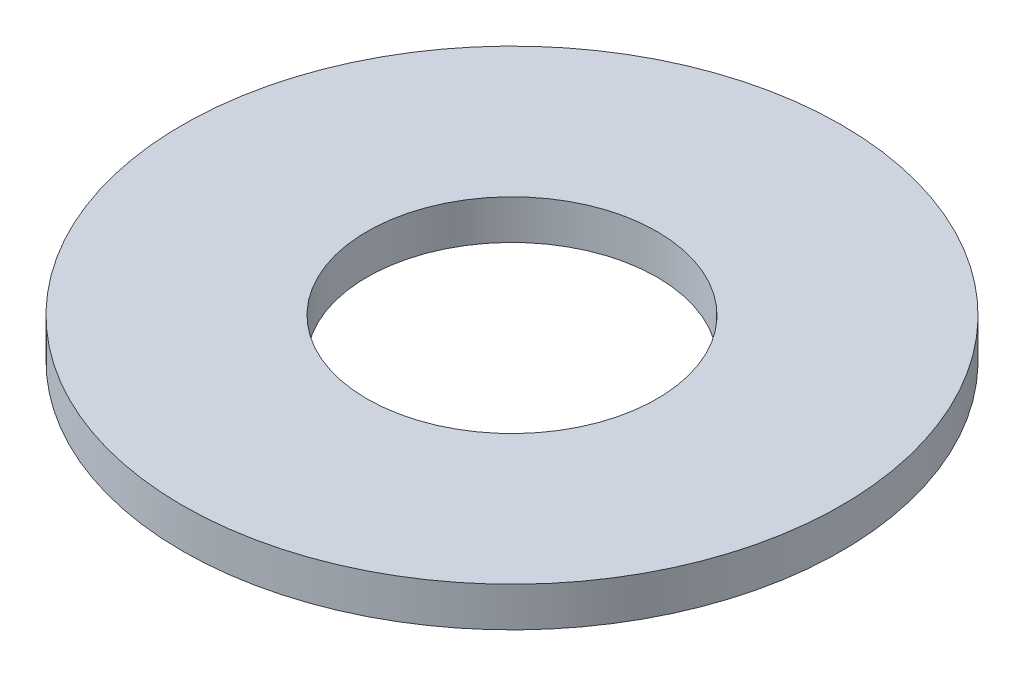
ISO-10303-21;
HEADER;
FILE_DESCRIPTION(('STEP AP214'),'2;1');
FILE_NAME('part.step','',(''),(''),'','','');
FILE_SCHEMA(('AUTOMOTIVE_DESIGN { 1 0 10303 214 1 1 1 1 }'));
ENDSEC;
DATA;
#1=APPLICATION_CONTEXT('core data for automotive mechanical design processes');
#2=APPLICATION_PROTOCOL_DEFINITION('international standard','automotive_design',2000,#1);
#3=PRODUCT_CONTEXT('',#1,'mechanical');
#4=PRODUCT('Part','Part','',(#3));
#5=PRODUCT_RELATED_PRODUCT_CATEGORY('part','',(#4));
#6=PRODUCT_DEFINITION_FORMATION('','',#4);
#7=PRODUCT_DEFINITION_CONTEXT('part definition',#1,'design');
#8=PRODUCT_DEFINITION('design','',#6,#7);
#9=PRODUCT_DEFINITION_SHAPE('','',#8);
#10=(LENGTH_UNIT() NAMED_UNIT(*) SI_UNIT(.MILLI.,.METRE.));
#11=(NAMED_UNIT(*) PLANE_ANGLE_UNIT() SI_UNIT($,.RADIAN.));
#12=(NAMED_UNIT(*) SI_UNIT($,.STERADIAN.) SOLID_ANGLE_UNIT());
#13=UNCERTAINTY_MEASURE_WITH_UNIT(LENGTH_MEASURE(1.E-05),#10,'distance_accuracy_value','');
#14=(GEOMETRIC_REPRESENTATION_CONTEXT(3) GLOBAL_UNCERTAINTY_ASSIGNED_CONTEXT((#13)) GLOBAL_UNIT_ASSIGNED_CONTEXT((#10,
#11,#12)) REPRESENTATION_CONTEXT('',''));
#15=CARTESIAN_POINT('',(0.,0.,0.));
#16=DIRECTION('',(0.,0.,1.));
#17=DIRECTION('',(1.,0.,0.));
#18=AXIS2_PLACEMENT_3D('',#15,#16,#17);
#19=CARTESIAN_POINT('',(0.,0.15,0.));
#20=DIRECTION('',(0.,1.,0.));
#21=DIRECTION('',(0.,0.,1.));
#22=AXIS2_PLACEMENT_3D('',#19,#20,#21);
#23=PLANE('',#22);
#24=CARTESIAN_POINT('',(0.,0.15,0.));
#25=DIRECTION('',(0.,1.,0.));
#26=DIRECTION('',(0.,0.,1.));
#27=AXIS2_PLACEMENT_3D('',#24,#25,#26);
#28=CIRCLE('',#27,2.5);
#29=CARTESIAN_POINT('',(0.,0.15,2.5));
#30=VERTEX_POINT('',#29);
#31=EDGE_CURVE('E10',#30,#30,#28,.T.);
#32=ORIENTED_EDGE('',*,*,#31,.T.);
#33=EDGE_LOOP('',(#32));
#34=FACE_BOUND('',#33,.T.);
#35=CARTESIAN_POINT('',(0.,0.15,0.));
#36=DIRECTION('',(0.,1.,0.));
#37=DIRECTION('',(0.,0.,1.));
#38=AXIS2_PLACEMENT_3D('',#35,#36,#37);
#39=CIRCLE('',#38,1.1);
#40=CARTESIAN_POINT('',(0.,0.15,1.1));
#41=VERTEX_POINT('',#40);
#42=EDGE_CURVE('E50',#41,#41,#39,.T.);
#43=ORIENTED_EDGE('',*,*,#42,.F.);
#44=EDGE_LOOP('',(#43));
#45=FACE_BOUND('',#44,.T.);
#46=ADVANCED_FACE('F37',(#34,#45),#23,.T.);
#47=CARTESIAN_POINT('',(0.,-0.15,0.));
#48=DIRECTION('',(0.,1.,0.));
#49=DIRECTION('',(0.,0.,1.));
#50=AXIS2_PLACEMENT_3D('',#47,#48,#49);
#51=PLANE('',#50);
#52=CARTESIAN_POINT('',(0.,-0.15,0.));
#53=DIRECTION('',(0.,1.,0.));
#54=DIRECTION('',(0.,0.,1.));
#55=AXIS2_PLACEMENT_3D('',#52,#53,#54);
#56=CIRCLE('',#55,2.5);
#57=CARTESIAN_POINT('',(0.,-0.15,2.5));
#58=VERTEX_POINT('',#57);
#59=EDGE_CURVE('E41',#58,#58,#56,.T.);
#60=ORIENTED_EDGE('',*,*,#59,.F.);
#61=EDGE_LOOP('',(#60));
#62=FACE_BOUND('',#61,.T.);
#63=CARTESIAN_POINT('',(0.,-0.15,0.));
#64=DIRECTION('',(0.,1.,0.));
#65=DIRECTION('',(0.,0.,1.));
#66=AXIS2_PLACEMENT_3D('',#63,#64,#65);
#67=CIRCLE('',#66,1.1);
#68=CARTESIAN_POINT('',(0.,-0.15,1.1));
#69=VERTEX_POINT('',#68);
#70=EDGE_CURVE('E52',#69,#69,#67,.T.);
#71=ORIENTED_EDGE('',*,*,#70,.T.);
#72=EDGE_LOOP('',(#71));
#73=FACE_BOUND('',#72,.T.);
#74=ADVANCED_FACE('F64',(#62,#73),#51,.F.);
#75=CARTESIAN_POINT('',(0.,0.15,0.));
#76=DIRECTION('',(0.,-1.,0.));
#77=DIRECTION('',(0.,0.,-1.));
#78=AXIS2_PLACEMENT_3D('',#75,#76,#77);
#79=CYLINDRICAL_SURFACE('',#78,2.5);
#80=ORIENTED_EDGE('',*,*,#31,.F.);
#81=EDGE_LOOP('',(#80));
#82=FACE_BOUND('',#81,.T.);
#83=ORIENTED_EDGE('',*,*,#59,.T.);
#84=EDGE_LOOP('',(#83));
#85=FACE_BOUND('',#84,.T.);
#86=ADVANCED_FACE('F39',(#82,#85),#79,.T.);
#87=CARTESIAN_POINT('',(0.,0.15,0.));
#88=DIRECTION('',(0.,-1.,0.));
#89=DIRECTION('',(0.,0.,-1.));
#90=AXIS2_PLACEMENT_3D('',#87,#88,#89);
#91=CYLINDRICAL_SURFACE('',#90,1.1);
#92=ORIENTED_EDGE('',*,*,#42,.T.);
#93=EDGE_LOOP('',(#92));
#94=FACE_BOUND('',#93,.T.);
#95=ORIENTED_EDGE('',*,*,#70,.F.);
#96=EDGE_LOOP('',(#95));
#97=FACE_BOUND('',#96,.T.);
#98=ADVANCED_FACE('F60',(#94,#97),#91,.F.);
#99=CLOSED_SHELL('',(#46,#74,#86,#98));
#100=MANIFOLD_SOLID_BREP('B2',#99);
#101=ADVANCED_BREP_SHAPE_REPRESENTATION('',(#18,#100),#14);
#102=SHAPE_DEFINITION_REPRESENTATION(#9,#101);
ENDSEC;
END-ISO-10303-21;
